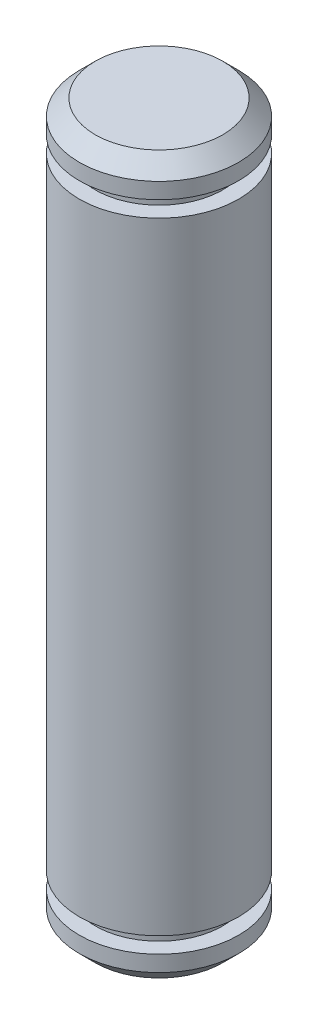
ISO-10303-21;
HEADER;
FILE_DESCRIPTION(('STEP AP214'),'2;1');
FILE_NAME('part.step','',(''),(''),'','','');
FILE_SCHEMA(('AUTOMOTIVE_DESIGN { 1 0 10303 214 1 1 1 1 }'));
ENDSEC;
DATA;
#1=APPLICATION_CONTEXT('core data for automotive mechanical design processes');
#2=APPLICATION_PROTOCOL_DEFINITION('international standard','automotive_design',2000,#1);
#3=PRODUCT_CONTEXT('',#1,'mechanical');
#4=PRODUCT('Part','Part','',(#3));
#5=PRODUCT_RELATED_PRODUCT_CATEGORY('part','',(#4));
#6=PRODUCT_DEFINITION_FORMATION('','',#4);
#7=PRODUCT_DEFINITION_CONTEXT('part definition',#1,'design');
#8=PRODUCT_DEFINITION('design','',#6,#7);
#9=PRODUCT_DEFINITION_SHAPE('','',#8);
#10=(LENGTH_UNIT() NAMED_UNIT(*) SI_UNIT(.MILLI.,.METRE.));
#11=(NAMED_UNIT(*) PLANE_ANGLE_UNIT() SI_UNIT($,.RADIAN.));
#12=(NAMED_UNIT(*) SI_UNIT($,.STERADIAN.) SOLID_ANGLE_UNIT());
#13=UNCERTAINTY_MEASURE_WITH_UNIT(LENGTH_MEASURE(1.E-05),#10,'distance_accuracy_value','');
#14=(GEOMETRIC_REPRESENTATION_CONTEXT(3) GLOBAL_UNCERTAINTY_ASSIGNED_CONTEXT((#13)) GLOBAL_UNIT_ASSIGNED_CONTEXT((#10,
#11,#12)) REPRESENTATION_CONTEXT('',''));
#15=CARTESIAN_POINT('',(0.,0.,0.));
#16=DIRECTION('',(0.,0.,1.));
#17=DIRECTION('',(1.,0.,0.));
#18=AXIS2_PLACEMENT_3D('',#15,#16,#17);
#19=CARTESIAN_POINT('',(0.,45.,0.));
#20=DIRECTION('',(0.,-1.,0.));
#21=DIRECTION('',(0.,0.,-1.));
#22=AXIS2_PLACEMENT_3D('',#19,#20,#21);
#23=CYLINDRICAL_SURFACE('',#22,5.);
#24=CARTESIAN_POINT('',(0.,42.,0.));
#25=DIRECTION('',(0.,-1.,0.));
#26=DIRECTION('',(0.,0.,-1.));
#27=AXIS2_PLACEMENT_3D('',#24,#25,#26);
#28=CIRCLE('',#27,5.);
#29=CARTESIAN_POINT('',(0.,42.,-5.));
#30=VERTEX_POINT('',#29);
#31=EDGE_CURVE('E73',#30,#30,#28,.T.);
#32=CARTESIAN_POINT('',(0.,3.,0.));
#33=DIRECTION('',(0.,-1.,0.));
#34=DIRECTION('',(0.,0.,-1.));
#35=AXIS2_PLACEMENT_3D('',#32,#33,#34);
#36=CIRCLE('',#35,5.);
#37=CARTESIAN_POINT('',(0.,3.00000000000001,-5.));
#38=VERTEX_POINT('',#37);
#39=EDGE_CURVE('E68',#38,#38,#36,.T.);
#40=CARTESIAN_POINT('',(0.,42.,-5.));
#41=CARTESIAN_POINT('',(0.,41.59375,-5.));
#42=CARTESIAN_POINT('',(0.,41.1875,-5.));
#43=CARTESIAN_POINT('',(0.,40.375,-5.));
#44=CARTESIAN_POINT('',(0.,39.96875,-5.));
#45=CARTESIAN_POINT('',(0.,39.15625,-5.));
#46=CARTESIAN_POINT('',(0.,38.75,-5.));
#47=CARTESIAN_POINT('',(0.,37.9375,-5.));
#48=CARTESIAN_POINT('',(0.,37.53125,-5.));
#49=CARTESIAN_POINT('',(0.,36.71875,-5.));
#50=CARTESIAN_POINT('',(0.,36.3125,-5.));
#51=CARTESIAN_POINT('',(0.,35.5,-5.));
#52=CARTESIAN_POINT('',(0.,35.09375,-5.));
#53=CARTESIAN_POINT('',(0.,34.28125,-5.));
#54=CARTESIAN_POINT('',(0.,33.875,-5.));
#55=CARTESIAN_POINT('',(0.,33.0625,-5.));
#56=CARTESIAN_POINT('',(0.,32.65625,-5.));
#57=CARTESIAN_POINT('',(0.,31.84375,-5.));
#58=CARTESIAN_POINT('',(0.,31.4375,-5.));
#59=CARTESIAN_POINT('',(0.,30.625,-5.));
#60=CARTESIAN_POINT('',(0.,30.21875,-5.));
#61=CARTESIAN_POINT('',(0.,29.40625,-5.));
#62=CARTESIAN_POINT('',(0.,29.,-5.));
#63=CARTESIAN_POINT('',(0.,28.1875,-5.));
#64=CARTESIAN_POINT('',(0.,27.78125,-5.));
#65=CARTESIAN_POINT('',(0.,26.96875,-5.));
#66=CARTESIAN_POINT('',(0.,26.5625,-5.));
#67=CARTESIAN_POINT('',(0.,25.75,-5.));
#68=CARTESIAN_POINT('',(0.,25.34375,-5.));
#69=CARTESIAN_POINT('',(0.,24.53125,-5.));
#70=CARTESIAN_POINT('',(0.,24.125,-5.));
#71=CARTESIAN_POINT('',(0.,23.3125,-5.));
#72=CARTESIAN_POINT('',(0.,22.90625,-5.));
#73=CARTESIAN_POINT('',(0.,22.09375,-5.));
#74=CARTESIAN_POINT('',(0.,21.6875,-5.));
#75=CARTESIAN_POINT('',(0.,20.875,-5.));
#76=CARTESIAN_POINT('',(0.,20.46875,-5.));
#77=CARTESIAN_POINT('',(0.,19.65625,-5.));
#78=CARTESIAN_POINT('',(0.,19.25,-5.));
#79=CARTESIAN_POINT('',(0.,18.4375,-5.));
#80=CARTESIAN_POINT('',(0.,18.03125,-5.));
#81=CARTESIAN_POINT('',(0.,17.21875,-5.));
#82=CARTESIAN_POINT('',(0.,16.8125,-5.));
#83=CARTESIAN_POINT('',(0.,16.,-5.));
#84=CARTESIAN_POINT('',(0.,15.59375,-5.));
#85=CARTESIAN_POINT('',(0.,14.78125,-5.));
#86=CARTESIAN_POINT('',(0.,14.375,-5.));
#87=CARTESIAN_POINT('',(0.,13.5625,-5.));
#88=CARTESIAN_POINT('',(0.,13.15625,-5.));
#89=CARTESIAN_POINT('',(0.,12.34375,-5.));
#90=CARTESIAN_POINT('',(0.,11.9375,-5.));
#91=CARTESIAN_POINT('',(0.,11.125,-5.));
#92=CARTESIAN_POINT('',(0.,10.71875,-5.));
#93=CARTESIAN_POINT('',(0.,9.90625000000001,-5.));
#94=CARTESIAN_POINT('',(0.,9.50000000000001,-5.));
#95=CARTESIAN_POINT('',(0.,8.68750000000001,-5.));
#96=CARTESIAN_POINT('',(0.,8.28125000000001,-5.));
#97=CARTESIAN_POINT('',(0.,7.46875000000001,-5.));
#98=CARTESIAN_POINT('',(0.,7.06250000000001,-5.));
#99=CARTESIAN_POINT('',(0.,6.25000000000001,-5.));
#100=CARTESIAN_POINT('',(0.,5.84375000000001,-5.));
#101=CARTESIAN_POINT('',(0.,5.03125000000001,-5.));
#102=CARTESIAN_POINT('',(0.,4.62500000000001,-5.));
#103=CARTESIAN_POINT('',(0.,3.81250000000001,-5.));
#104=CARTESIAN_POINT('',(0.,3.40625000000001,-5.));
#105=CARTESIAN_POINT('',(0.,3.00000000000001,-5.));
#106=B_SPLINE_CURVE_WITH_KNOTS('',3,(#40,#41,#42,#43,#44,#45,#46,#47,#48,#49,#50,#51,#52,#53,
#54,#55,#56,#57,#58,#59,#60,#61,#62,#63,#64,#65,#66,#67,#68,#69,#70,#71,#72,#73,#74,#75,#76,#77,
#78,#79,#80,#81,#82,#83,#84,#85,#86,#87,#88,#89,#90,#91,#92,#93,#94,#95,#96,#97,#98,#99,#100,
#101,#102,#103,#104,#105),.UNSPECIFIED.,.F.,.F.,(4,2,2,2,2,2,2,2,2,2,2,2,2,2,2,2,2,2,2,2,2,2,2,
2,2,2,2,2,2,2,2,2,4),(0.,1.21875,2.4375,3.65624999999999,4.875,6.09374999999999,
7.31249999999999,8.53125,9.74999999999999,10.96875,12.1875,13.40625,14.625,15.84375,17.0625,
18.28125,19.5,20.71875,21.9375,23.15625,24.375,25.59375,26.8125,28.03125,29.25,30.46875,31.6875,
32.90625,34.125,35.34375,36.5625,37.78125,39.),.UNSPECIFIED.);
#107=EDGE_CURVE('BSEAM43',#30,#38,#106,.T.);
#108=ORIENTED_EDGE('',*,*,#31,.T.);
#109=ORIENTED_EDGE('',*,*,#39,.F.);
#110=ORIENTED_EDGE('',*,*,#107,.T.);
#111=ORIENTED_EDGE('',*,*,#107,.F.);
#112=EDGE_LOOP('',(#108,#110,#109,#111));
#113=FACE_BOUND('',#112,.T.);
#114=ADVANCED_FACE('F43',(#113),#23,.T.);
#115=CARTESIAN_POINT('',(0.,3.,0.));
#116=DIRECTION('',(0.,-1.,0.));
#117=DIRECTION('',(0.,0.,-1.));
#118=AXIS2_PLACEMENT_3D('',#115,#116,#117);
#119=PLANE('',#118);
#120=CARTESIAN_POINT('',(0.,3.,0.));
#121=DIRECTION('',(0.,-1.,0.));
#122=DIRECTION('',(0.,0.,-1.));
#123=AXIS2_PLACEMENT_3D('',#120,#121,#122);
#124=CIRCLE('',#123,4.);
#125=CARTESIAN_POINT('',(0.,3.,-4.));
#126=VERTEX_POINT('',#125);
#127=EDGE_CURVE('E69',#126,#126,#124,.T.);
#128=ORIENTED_EDGE('',*,*,#127,.F.);
#129=EDGE_LOOP('',(#128));
#130=FACE_BOUND('',#129,.T.);
#131=ORIENTED_EDGE('',*,*,#39,.T.);
#132=EDGE_LOOP('',(#131));
#133=FACE_BOUND('',#132,.T.);
#134=ADVANCED_FACE('F123',(#130,#133),#119,.T.);
#135=CARTESIAN_POINT('',(0.,2.,0.));
#136=DIRECTION('',(0.,-1.,0.));
#137=DIRECTION('',(0.,0.,-1.));
#138=AXIS2_PLACEMENT_3D('',#135,#136,#137);
#139=PLANE('',#138);
#140=CARTESIAN_POINT('',(0.,2.,0.));
#141=DIRECTION('',(0.,-1.,0.));
#142=DIRECTION('',(0.,0.,-1.));
#143=AXIS2_PLACEMENT_3D('',#140,#141,#142);
#144=CIRCLE('',#143,4.);
#145=CARTESIAN_POINT('',(0.,2.,-4.));
#146=VERTEX_POINT('',#145);
#147=EDGE_CURVE('E83',#146,#146,#144,.T.);
#148=ORIENTED_EDGE('',*,*,#147,.T.);
#149=EDGE_LOOP('',(#148));
#150=FACE_BOUND('',#149,.T.);
#151=CARTESIAN_POINT('',(0.,2.,0.));
#152=DIRECTION('',(0.,-1.,0.));
#153=DIRECTION('',(0.,0.,-1.));
#154=AXIS2_PLACEMENT_3D('',#151,#152,#153);
#155=CIRCLE('',#154,5.);
#156=CARTESIAN_POINT('',(0.,2.00000000000001,-5.));
#157=VERTEX_POINT('',#156);
#158=EDGE_CURVE('E64',#157,#157,#155,.T.);
#159=ORIENTED_EDGE('',*,*,#158,.F.);
#160=EDGE_LOOP('',(#159));
#161=FACE_BOUND('',#160,.T.);
#162=ADVANCED_FACE('F127',(#150,#161),#139,.F.);
#163=CARTESIAN_POINT('',(0.,3.,0.));
#164=DIRECTION('',(0.,-1.,0.));
#165=DIRECTION('',(0.,0.,-1.));
#166=AXIS2_PLACEMENT_3D('',#163,#164,#165);
#167=CYLINDRICAL_SURFACE('',#166,4.);
#168=ORIENTED_EDGE('',*,*,#127,.T.);
#169=EDGE_LOOP('',(#168));
#170=FACE_BOUND('',#169,.T.);
#171=ORIENTED_EDGE('',*,*,#147,.F.);
#172=EDGE_LOOP('',(#171));
#173=FACE_BOUND('',#172,.T.);
#174=ADVANCED_FACE('F120',(#170,#173),#167,.T.);
#175=CARTESIAN_POINT('',(0.,0.,0.));
#176=DIRECTION('',(0.,1.,0.));
#177=DIRECTION('',(0.,0.,1.));
#178=AXIS2_PLACEMENT_3D('',#175,#176,#177);
#179=PLANE('',#178);
#180=CARTESIAN_POINT('',(0.,0.,0.));
#181=DIRECTION('',(0.,1.,0.));
#182=DIRECTION('',(0.,0.,1.));
#183=AXIS2_PLACEMENT_3D('',#180,#181,#182);
#184=CIRCLE('',#183,3.99999999999995);
#185=CARTESIAN_POINT('',(0.,0.,3.99999999999995));
#186=VERTEX_POINT('',#185);
#187=EDGE_CURVE('E10',#186,#186,#184,.F.);
#188=ORIENTED_EDGE('',*,*,#187,.T.);
#189=EDGE_LOOP('',(#188));
#190=FACE_BOUND('',#189,.T.);
#191=ADVANCED_FACE('F110',(#190),#179,.F.);
#192=CARTESIAN_POINT('',(0.,1.00000000000004,0.));
#193=DIRECTION('',(0.,1.,0.));
#194=DIRECTION('',(0.,0.,1.));
#195=AXIS2_PLACEMENT_3D('',#192,#193,#194);
#196=CONICAL_SURFACE('',#195,5.,0.78539816339745);
#197=ORIENTED_EDGE('',*,*,#187,.F.);
#198=EDGE_LOOP('',(#197));
#199=FACE_BOUND('',#198,.T.);
#200=CARTESIAN_POINT('',(0.,1.00000000000004,0.));
#201=DIRECTION('',(0.,1.,0.));
#202=DIRECTION('',(0.,0.,1.));
#203=AXIS2_PLACEMENT_3D('',#200,#201,#202);
#204=CIRCLE('',#203,5.);
#205=CARTESIAN_POINT('',(0.,1.00000000000004,-5.));
#206=VERTEX_POINT('',#205);
#207=EDGE_CURVE('E60',#206,#206,#204,.T.);
#208=ORIENTED_EDGE('',*,*,#207,.F.);
#209=EDGE_LOOP('',(#208));
#210=FACE_BOUND('',#209,.T.);
#211=ADVANCED_FACE('F46',(#199,#210),#196,.T.);
#212=CARTESIAN_POINT('',(0.,2.00000000000001,-5.));
#213=CARTESIAN_POINT('',(0.,1.98958333333334,-5.));
#214=CARTESIAN_POINT('',(0.,1.97916666666668,-5.));
#215=CARTESIAN_POINT('',(0.,1.95833333333334,-5.));
#216=CARTESIAN_POINT('',(0.,1.94791666666668,-5.));
#217=CARTESIAN_POINT('',(0.,1.92708333333334,-5.));
#218=CARTESIAN_POINT('',(0.,1.91666666666668,-5.));
#219=CARTESIAN_POINT('',(0.,1.89583333333334,-5.));
#220=CARTESIAN_POINT('',(0.,1.88541666666668,-5.));
#221=CARTESIAN_POINT('',(0.,1.86458333333334,-5.));
#222=CARTESIAN_POINT('',(0.,1.85416666666668,-5.));
#223=CARTESIAN_POINT('',(0.,1.83333333333335,-5.));
#224=CARTESIAN_POINT('',(0.,1.82291666666668,-5.));
#225=CARTESIAN_POINT('',(0.,1.80208333333335,-5.));
#226=CARTESIAN_POINT('',(0.,1.79166666666668,-5.));
#227=CARTESIAN_POINT('',(0.,1.77083333333335,-5.));
#228=CARTESIAN_POINT('',(0.,1.76041666666668,-5.));
#229=CARTESIAN_POINT('',(0.,1.73958333333335,-5.));
#230=CARTESIAN_POINT('',(0.,1.72916666666668,-5.));
#231=CARTESIAN_POINT('',(0.,1.70833333333335,-5.));
#232=CARTESIAN_POINT('',(0.,1.69791666666668,-5.));
#233=CARTESIAN_POINT('',(0.,1.67708333333335,-5.));
#234=CARTESIAN_POINT('',(0.,1.66666666666668,-5.));
#235=CARTESIAN_POINT('',(0.,1.64583333333335,-5.));
#236=CARTESIAN_POINT('',(0.,1.63541666666669,-5.));
#237=CARTESIAN_POINT('',(0.,1.61458333333335,-5.));
#238=CARTESIAN_POINT('',(0.,1.60416666666669,-5.));
#239=CARTESIAN_POINT('',(0.,1.58333333333335,-5.));
#240=CARTESIAN_POINT('',(0.,1.57291666666669,-5.));
#241=CARTESIAN_POINT('',(0.,1.55208333333335,-5.));
#242=CARTESIAN_POINT('',(0.,1.54166666666669,-5.));
#243=CARTESIAN_POINT('',(0.,1.52083333333335,-5.));
#244=CARTESIAN_POINT('',(0.,1.51041666666669,-5.));
#245=CARTESIAN_POINT('',(0.,1.48958333333336,-5.));
#246=CARTESIAN_POINT('',(0.,1.47916666666669,-5.));
#247=CARTESIAN_POINT('',(0.,1.45833333333336,-5.));
#248=CARTESIAN_POINT('',(0.,1.44791666666669,-5.));
#249=CARTESIAN_POINT('',(0.,1.42708333333336,-5.));
#250=CARTESIAN_POINT('',(0.,1.41666666666669,-5.));
#251=CARTESIAN_POINT('',(0.,1.39583333333336,-5.));
#252=CARTESIAN_POINT('',(0.,1.38541666666669,-5.));
#253=CARTESIAN_POINT('',(0.,1.36458333333336,-5.));
#254=CARTESIAN_POINT('',(0.,1.35416666666669,-5.));
#255=CARTESIAN_POINT('',(0.,1.33333333333336,-5.));
#256=CARTESIAN_POINT('',(0.,1.32291666666669,-5.));
#257=CARTESIAN_POINT('',(0.,1.30208333333336,-5.));
#258=CARTESIAN_POINT('',(0.,1.29166666666669,-5.));
#259=CARTESIAN_POINT('',(0.,1.27083333333336,-5.));
#260=CARTESIAN_POINT('',(0.,1.26041666666669,-5.));
#261=CARTESIAN_POINT('',(0.,1.23958333333336,-5.));
#262=CARTESIAN_POINT('',(0.,1.2291666666667,-5.));
#263=CARTESIAN_POINT('',(0.,1.20833333333336,-5.));
#264=CARTESIAN_POINT('',(0.,1.1979166666667,-5.));
#265=CARTESIAN_POINT('',(0.,1.17708333333336,-5.));
#266=CARTESIAN_POINT('',(0.,1.1666666666667,-5.));
#267=CARTESIAN_POINT('',(0.,1.14583333333337,-5.));
#268=CARTESIAN_POINT('',(0.,1.1354166666667,-5.));
#269=CARTESIAN_POINT('',(0.,1.11458333333337,-5.));
#270=CARTESIAN_POINT('',(0.,1.1041666666667,-5.));
#271=CARTESIAN_POINT('',(0.,1.08333333333337,-5.));
#272=CARTESIAN_POINT('',(0.,1.0729166666667,-5.));
#273=CARTESIAN_POINT('',(0.,1.05208333333337,-5.));
#274=CARTESIAN_POINT('',(0.,1.0416666666667,-5.));
#275=CARTESIAN_POINT('',(0.,1.02083333333337,-5.));
#276=CARTESIAN_POINT('',(0.,1.0104166666667,-5.));
#277=CARTESIAN_POINT('',(0.,1.00000000000004,-5.));
#278=B_SPLINE_CURVE_WITH_KNOTS('',3,(#212,#213,#214,#215,#216,#217,#218,#219,#220,#221,#222,
#223,#224,#225,#226,#227,#228,#229,#230,#231,#232,#233,#234,#235,#236,#237,#238,#239,#240,#241,
#242,#243,#244,#245,#246,#247,#248,#249,#250,#251,#252,#253,#254,#255,#256,#257,#258,#259,#260,
#261,#262,#263,#264,#265,#266,#267,#268,#269,#270,#271,#272,#273,#274,#275,#276,#277),
.UNSPECIFIED.,.F.,.F.,(4,2,2,2,2,2,2,2,2,2,2,2,2,2,2,2,2,2,2,2,2,2,2,2,2,2,2,2,2,2,2,2,4),(0.,
0.0312499999999966,0.0625000000000001,0.0937499999999966,0.125,0.156249999999997,
0.187499999999993,0.218749999999997,0.249999999999993,0.28124999999999,0.312499999999993,
0.34374999999999,0.374999999999986,0.40624999999999,0.437499999999987,0.46874999999999,
0.499999999999987,0.531249999999983,0.562499999999987,0.593749999999983,0.624999999999987,
0.656249999999983,0.68749999999998,0.718749999999983,0.74999999999998,0.781249999999976,
0.81249999999998,0.843749999999976,0.874999999999973,0.906249999999976,0.937499999999973,
0.968749999999977,0.999999999999973),.UNSPECIFIED.);
#279=EDGE_CURVE('BSEAM107',#157,#206,#278,.T.);
#280=ORIENTED_EDGE('',*,*,#158,.T.);
#281=ORIENTED_EDGE('',*,*,#207,.T.);
#282=ORIENTED_EDGE('',*,*,#279,.T.);
#283=ORIENTED_EDGE('',*,*,#279,.F.);
#284=EDGE_LOOP('',(#280,#282,#281,#283));
#285=FACE_BOUND('',#284,.T.);
#286=ADVANCED_FACE('F107',(#285),#23,.T.);
#287=CARTESIAN_POINT('',(0.,43.,0.));
#288=DIRECTION('',(0.,-1.,0.));
#289=DIRECTION('',(0.,0.,-1.));
#290=AXIS2_PLACEMENT_3D('',#287,#288,#289);
#291=PLANE('',#290);
#292=CARTESIAN_POINT('',(0.,43.,0.));
#293=DIRECTION('',(0.,-1.,0.));
#294=DIRECTION('',(0.,0.,-1.));
#295=AXIS2_PLACEMENT_3D('',#292,#293,#294);
#296=CIRCLE('',#295,4.);
#297=CARTESIAN_POINT('',(0.,43.,-4.));
#298=VERTEX_POINT('',#297);
#299=EDGE_CURVE('E76',#298,#298,#296,.T.);
#300=ORIENTED_EDGE('',*,*,#299,.F.);
#301=EDGE_LOOP('',(#300));
#302=FACE_BOUND('',#301,.T.);
#303=CARTESIAN_POINT('',(0.,43.,0.));
#304=DIRECTION('',(0.,-1.,0.));
#305=DIRECTION('',(0.,0.,-1.));
#306=AXIS2_PLACEMENT_3D('',#303,#304,#305);
#307=CIRCLE('',#306,5.);
#308=CARTESIAN_POINT('',(0.,43.,-5.));
#309=VERTEX_POINT('',#308);
#310=EDGE_CURVE('E48',#309,#309,#307,.T.);
#311=ORIENTED_EDGE('',*,*,#310,.T.);
#312=EDGE_LOOP('',(#311));
#313=FACE_BOUND('',#312,.T.);
#314=ADVANCED_FACE('F116',(#302,#313),#291,.T.);
#315=CARTESIAN_POINT('',(0.,42.,0.));
#316=DIRECTION('',(0.,-1.,0.));
#317=DIRECTION('',(0.,0.,-1.));
#318=AXIS2_PLACEMENT_3D('',#315,#316,#317);
#319=PLANE('',#318);
#320=CARTESIAN_POINT('',(0.,42.,0.));
#321=DIRECTION('',(0.,-1.,0.));
#322=DIRECTION('',(0.,0.,-1.));
#323=AXIS2_PLACEMENT_3D('',#320,#321,#322);
#324=CIRCLE('',#323,4.);
#325=CARTESIAN_POINT('',(0.,42.,-4.));
#326=VERTEX_POINT('',#325);
#327=EDGE_CURVE('E85',#326,#326,#324,.T.);
#328=ORIENTED_EDGE('',*,*,#327,.T.);
#329=EDGE_LOOP('',(#328));
#330=FACE_BOUND('',#329,.T.);
#331=ORIENTED_EDGE('',*,*,#31,.F.);
#332=EDGE_LOOP('',(#331));
#333=FACE_BOUND('',#332,.T.);
#334=ADVANCED_FACE('F144',(#330,#333),#319,.F.);
#335=CARTESIAN_POINT('',(0.,43.,0.));
#336=DIRECTION('',(0.,-1.,0.));
#337=DIRECTION('',(0.,0.,-1.));
#338=AXIS2_PLACEMENT_3D('',#335,#336,#337);
#339=CYLINDRICAL_SURFACE('',#338,4.);
#340=ORIENTED_EDGE('',*,*,#299,.T.);
#341=EDGE_LOOP('',(#340));
#342=FACE_BOUND('',#341,.T.);
#343=ORIENTED_EDGE('',*,*,#327,.F.);
#344=EDGE_LOOP('',(#343));
#345=FACE_BOUND('',#344,.T.);
#346=ADVANCED_FACE('F150',(#342,#345),#339,.T.);
#347=CARTESIAN_POINT('',(0.,45.,0.));
#348=DIRECTION('',(0.,1.,0.));
#349=DIRECTION('',(0.,0.,1.));
#350=AXIS2_PLACEMENT_3D('',#347,#348,#349);
#351=PLANE('',#350);
#352=CARTESIAN_POINT('',(0.,45.,0.));
#353=DIRECTION('',(0.,1.,0.));
#354=DIRECTION('',(0.,0.,1.));
#355=AXIS2_PLACEMENT_3D('',#352,#353,#354);
#356=CIRCLE('',#355,4.00000000000002);
#357=CARTESIAN_POINT('',(0.,45.,4.00000000000002));
#358=VERTEX_POINT('',#357);
#359=EDGE_CURVE('E72',#358,#358,#356,.T.);
#360=ORIENTED_EDGE('',*,*,#359,.T.);
#361=EDGE_LOOP('',(#360));
#362=FACE_BOUND('',#361,.T.);
#363=ADVANCED_FACE('F137',(#362),#351,.T.);
#364=CARTESIAN_POINT('',(0.,45.,0.));
#365=DIRECTION('',(0.,-1.,0.));
#366=DIRECTION('',(0.,0.,-1.));
#367=AXIS2_PLACEMENT_3D('',#364,#365,#366);
#368=CONICAL_SURFACE('',#367,4.00000000000002,0.785398163397447);
#369=CARTESIAN_POINT('',(0.,44.,0.));
#370=DIRECTION('',(0.,1.,0.));
#371=DIRECTION('',(0.,0.,1.));
#372=AXIS2_PLACEMENT_3D('',#369,#370,#371);
#373=CIRCLE('',#372,5.);
#374=CARTESIAN_POINT('',(0.,44.,-5.));
#375=VERTEX_POINT('',#374);
#376=EDGE_CURVE('E53',#375,#375,#373,.F.);
#377=ORIENTED_EDGE('',*,*,#376,.F.);
#378=EDGE_LOOP('',(#377));
#379=FACE_BOUND('',#378,.T.);
#380=ORIENTED_EDGE('',*,*,#359,.F.);
#381=EDGE_LOOP('',(#380));
#382=FACE_BOUND('',#381,.T.);
#383=ADVANCED_FACE('F132',(#379,#382),#368,.T.);
#384=CARTESIAN_POINT('',(0.,44.,-5.));
#385=CARTESIAN_POINT('',(0.,43.9895833333333,-5.));
#386=CARTESIAN_POINT('',(0.,43.9791666666667,-5.));
#387=CARTESIAN_POINT('',(0.,43.9583333333333,-5.));
#388=CARTESIAN_POINT('',(0.,43.9479166666667,-5.));
#389=CARTESIAN_POINT('',(0.,43.9270833333333,-5.));
#390=CARTESIAN_POINT('',(0.,43.9166666666667,-5.));
#391=CARTESIAN_POINT('',(0.,43.8958333333333,-5.));
#392=CARTESIAN_POINT('',(0.,43.8854166666667,-5.));
#393=CARTESIAN_POINT('',(0.,43.8645833333333,-5.));
#394=CARTESIAN_POINT('',(0.,43.8541666666667,-5.));
#395=CARTESIAN_POINT('',(0.,43.8333333333333,-5.));
#396=CARTESIAN_POINT('',(0.,43.8229166666667,-5.));
#397=CARTESIAN_POINT('',(0.,43.8020833333333,-5.));
#398=CARTESIAN_POINT('',(0.,43.7916666666667,-5.));
#399=CARTESIAN_POINT('',(0.,43.7708333333333,-5.));
#400=CARTESIAN_POINT('',(0.,43.7604166666667,-5.));
#401=CARTESIAN_POINT('',(0.,43.7395833333333,-5.));
#402=CARTESIAN_POINT('',(0.,43.7291666666667,-5.));
#403=CARTESIAN_POINT('',(0.,43.7083333333333,-5.));
#404=CARTESIAN_POINT('',(0.,43.6979166666667,-5.));
#405=CARTESIAN_POINT('',(0.,43.6770833333333,-5.));
#406=CARTESIAN_POINT('',(0.,43.6666666666667,-5.));
#407=CARTESIAN_POINT('',(0.,43.6458333333333,-5.));
#408=CARTESIAN_POINT('',(0.,43.6354166666667,-5.));
#409=CARTESIAN_POINT('',(0.,43.6145833333333,-5.));
#410=CARTESIAN_POINT('',(0.,43.6041666666667,-5.));
#411=CARTESIAN_POINT('',(0.,43.5833333333333,-5.));
#412=CARTESIAN_POINT('',(0.,43.5729166666667,-5.));
#413=CARTESIAN_POINT('',(0.,43.5520833333333,-5.));
#414=CARTESIAN_POINT('',(0.,43.5416666666667,-5.));
#415=CARTESIAN_POINT('',(0.,43.5208333333333,-5.));
#416=CARTESIAN_POINT('',(0.,43.5104166666667,-5.));
#417=CARTESIAN_POINT('',(0.,43.4895833333333,-5.));
#418=CARTESIAN_POINT('',(0.,43.4791666666667,-5.));
#419=CARTESIAN_POINT('',(0.,43.4583333333333,-5.));
#420=CARTESIAN_POINT('',(0.,43.4479166666667,-5.));
#421=CARTESIAN_POINT('',(0.,43.4270833333333,-5.));
#422=CARTESIAN_POINT('',(0.,43.4166666666667,-5.));
#423=CARTESIAN_POINT('',(0.,43.3958333333333,-5.));
#424=CARTESIAN_POINT('',(0.,43.3854166666667,-5.));
#425=CARTESIAN_POINT('',(0.,43.3645833333333,-5.));
#426=CARTESIAN_POINT('',(0.,43.3541666666667,-5.));
#427=CARTESIAN_POINT('',(0.,43.3333333333333,-5.));
#428=CARTESIAN_POINT('',(0.,43.3229166666667,-5.));
#429=CARTESIAN_POINT('',(0.,43.3020833333333,-5.));
#430=CARTESIAN_POINT('',(0.,43.2916666666667,-5.));
#431=CARTESIAN_POINT('',(0.,43.2708333333333,-5.));
#432=CARTESIAN_POINT('',(0.,43.2604166666667,-5.));
#433=CARTESIAN_POINT('',(0.,43.2395833333333,-5.));
#434=CARTESIAN_POINT('',(0.,43.2291666666667,-5.));
#435=CARTESIAN_POINT('',(0.,43.2083333333333,-5.));
#436=CARTESIAN_POINT('',(0.,43.1979166666667,-5.));
#437=CARTESIAN_POINT('',(0.,43.1770833333333,-5.));
#438=CARTESIAN_POINT('',(0.,43.1666666666667,-5.));
#439=CARTESIAN_POINT('',(0.,43.1458333333333,-5.));
#440=CARTESIAN_POINT('',(0.,43.1354166666667,-5.));
#441=CARTESIAN_POINT('',(0.,43.1145833333333,-5.));
#442=CARTESIAN_POINT('',(0.,43.1041666666667,-5.));
#443=CARTESIAN_POINT('',(0.,43.0833333333333,-5.));
#444=CARTESIAN_POINT('',(0.,43.0729166666667,-5.));
#445=CARTESIAN_POINT('',(0.,43.0520833333333,-5.));
#446=CARTESIAN_POINT('',(0.,43.0416666666667,-5.));
#447=CARTESIAN_POINT('',(0.,43.0208333333333,-5.));
#448=CARTESIAN_POINT('',(0.,43.0104166666667,-5.));
#449=CARTESIAN_POINT('',(0.,43.,-5.));
#450=B_SPLINE_CURVE_WITH_KNOTS('',3,(#384,#385,#386,#387,#388,#389,#390,#391,#392,#393,#394,
#395,#396,#397,#398,#399,#400,#401,#402,#403,#404,#405,#406,#407,#408,#409,#410,#411,#412,#413,
#414,#415,#416,#417,#418,#419,#420,#421,#422,#423,#424,#425,#426,#427,#428,#429,#430,#431,#432,
#433,#434,#435,#436,#437,#438,#439,#440,#441,#442,#443,#444,#445,#446,#447,#448,#449),
.UNSPECIFIED.,.F.,.F.,(4,2,2,2,2,2,2,2,2,2,2,2,2,2,2,2,2,2,2,2,2,2,2,2,2,2,2,2,2,2,2,2,4),(0.,
0.0312500000000035,0.062500000000007,0.0937500000000036,0.125000000000007,0.156250000000004,
0.187500000000007,0.218750000000004,0.250000000000007,0.281250000000004,0.312500000000007,
0.343750000000004,0.375000000000007,0.406250000000004,0.437500000000007,0.468750000000011,
0.500000000000007,0.531250000000011,0.562500000000007,0.593750000000011,0.625000000000008,
0.656250000000011,0.687500000000008,0.718750000000011,0.750000000000008,0.781250000000011,
0.812500000000008,0.843750000000011,0.875000000000008,0.906250000000011,0.937500000000015,
0.968750000000011,1.00000000000001),.UNSPECIFIED.);
#451=EDGE_CURVE('BSEAM119',#375,#309,#450,.T.);
#452=ORIENTED_EDGE('',*,*,#376,.T.);
#453=ORIENTED_EDGE('',*,*,#310,.F.);
#454=ORIENTED_EDGE('',*,*,#451,.T.);
#455=ORIENTED_EDGE('',*,*,#451,.F.);
#456=EDGE_LOOP('',(#452,#454,#453,#455));
#457=FACE_BOUND('',#456,.T.);
#458=ADVANCED_FACE('F119',(#457),#23,.T.);
#459=CLOSED_SHELL('',(#114,#134,#162,#174,#191,#211,#286,#314,#334,#346,#363,#383,#458));
#460=MANIFOLD_SOLID_BREP('B2',#459);
#461=ADVANCED_BREP_SHAPE_REPRESENTATION('',(#18,#460),#14);
#462=SHAPE_DEFINITION_REPRESENTATION(#9,#461);
ENDSEC;
END-ISO-10303-21;
